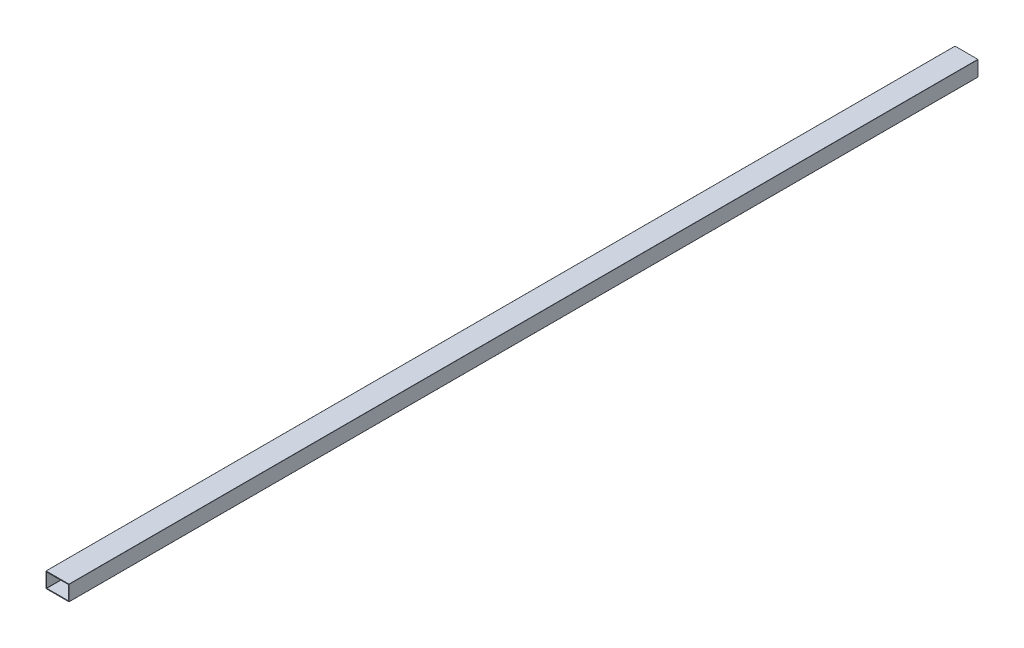
ISO-10303-21;
HEADER;
FILE_DESCRIPTION(('STEP AP214'),'2;1');
FILE_NAME('part.step','',(''),(''),'','','');
FILE_SCHEMA(('AUTOMOTIVE_DESIGN { 1 0 10303 214 1 1 1 1 }'));
ENDSEC;
DATA;
#1=APPLICATION_CONTEXT('core data for automotive mechanical design processes');
#2=APPLICATION_PROTOCOL_DEFINITION('international standard','automotive_design',2000,#1);
#3=PRODUCT_CONTEXT('',#1,'mechanical');
#4=PRODUCT('Part','Part','',(#3));
#5=PRODUCT_RELATED_PRODUCT_CATEGORY('part','',(#4));
#6=PRODUCT_DEFINITION_FORMATION('','',#4);
#7=PRODUCT_DEFINITION_CONTEXT('part definition',#1,'design');
#8=PRODUCT_DEFINITION('design','',#6,#7);
#9=PRODUCT_DEFINITION_SHAPE('','',#8);
#10=(LENGTH_UNIT() NAMED_UNIT(*) SI_UNIT(.MILLI.,.METRE.));
#11=(NAMED_UNIT(*) PLANE_ANGLE_UNIT() SI_UNIT($,.RADIAN.));
#12=(NAMED_UNIT(*) SI_UNIT($,.STERADIAN.) SOLID_ANGLE_UNIT());
#13=UNCERTAINTY_MEASURE_WITH_UNIT(LENGTH_MEASURE(1.E-05),#10,'distance_accuracy_value','');
#14=(GEOMETRIC_REPRESENTATION_CONTEXT(3) GLOBAL_UNCERTAINTY_ASSIGNED_CONTEXT((#13)) GLOBAL_UNIT_ASSIGNED_CONTEXT((#10,
#11,#12)) REPRESENTATION_CONTEXT('',''));
#15=CARTESIAN_POINT('',(0.,0.,0.));
#16=DIRECTION('',(0.,0.,1.));
#17=DIRECTION('',(1.,0.,0.));
#18=AXIS2_PLACEMENT_3D('',#15,#16,#17);
#19=CARTESIAN_POINT('',(76.2,-50.8,-6000.));
#20=DIRECTION('',(1.,0.,0.));
#21=DIRECTION('',(0.,0.,-1.));
#22=AXIS2_PLACEMENT_3D('',#19,#20,#21);
#23=PLANE('',#22);
#24=DIRECTION('',(0.,1.,0.));
#25=VECTOR('',#24,1.);
#26=CARTESIAN_POINT('',(76.2,-50.8,0.));
#27=LINE('',#26,#25);
#28=CARTESIAN_POINT('',(76.2,-49.8,0.));
#29=VERTEX_POINT('',#28);
#30=CARTESIAN_POINT('',(76.2,49.8,0.));
#31=VERTEX_POINT('',#30);
#32=EDGE_CURVE('E197',#29,#31,#27,.T.);
#33=ORIENTED_EDGE('',*,*,#32,.F.);
#34=DIRECTION('',(0.,0.,1.));
#35=VECTOR('',#34,1.);
#36=CARTESIAN_POINT('',(76.2,-49.8,-6000.));
#37=LINE('',#36,#35);
#38=CARTESIAN_POINT('',(76.2,-49.8,-6000.));
#39=VERTEX_POINT('',#38);
#40=EDGE_CURVE('E158',#29,#39,#37,.F.);
#41=ORIENTED_EDGE('',*,*,#40,.T.);
#42=DIRECTION('',(0.,1.,0.));
#43=VECTOR('',#42,1.);
#44=CARTESIAN_POINT('',(76.2,-50.8,-6000.));
#45=LINE('',#44,#43);
#46=CARTESIAN_POINT('',(76.2,49.8,-6000.));
#47=VERTEX_POINT('',#46);
#48=EDGE_CURVE('E185',#39,#47,#45,.T.);
#49=ORIENTED_EDGE('',*,*,#48,.T.);
#50=DIRECTION('',(0.,0.,1.));
#51=VECTOR('',#50,1.);
#52=CARTESIAN_POINT('',(76.2,49.8,-6000.));
#53=LINE('',#52,#51);
#54=EDGE_CURVE('E251',#47,#31,#53,.T.);
#55=ORIENTED_EDGE('',*,*,#54,.T.);
#56=EDGE_LOOP('',(#33,#41,#49,#55));
#57=FACE_BOUND('',#56,.T.);
#58=ADVANCED_FACE('F33',(#57),#23,.T.);
#59=CARTESIAN_POINT('',(-76.2,-50.8,-6000.));
#60=DIRECTION('',(0.,-1.,0.));
#61=DIRECTION('',(0.,0.,-1.));
#62=AXIS2_PLACEMENT_3D('',#59,#60,#61);
#63=PLANE('',#62);
#64=DIRECTION('',(1.,0.,0.));
#65=VECTOR('',#64,1.);
#66=CARTESIAN_POINT('',(-76.2,-50.8,0.));
#67=LINE('',#66,#65);
#68=CARTESIAN_POINT('',(-75.2,-50.8,0.));
#69=VERTEX_POINT('',#68);
#70=CARTESIAN_POINT('',(75.2,-50.8,0.));
#71=VERTEX_POINT('',#70);
#72=EDGE_CURVE('E189',#69,#71,#67,.T.);
#73=ORIENTED_EDGE('',*,*,#72,.F.);
#74=DIRECTION('',(0.,0.,1.));
#75=VECTOR('',#74,1.);
#76=CARTESIAN_POINT('',(-75.2,-50.8,-6000.));
#77=LINE('',#76,#75);
#78=CARTESIAN_POINT('',(-75.2,-50.8,-6000.));
#79=VERTEX_POINT('',#78);
#80=EDGE_CURVE('E238',#69,#79,#77,.F.);
#81=ORIENTED_EDGE('',*,*,#80,.T.);
#82=DIRECTION('',(1.,0.,0.));
#83=VECTOR('',#82,1.);
#84=CARTESIAN_POINT('',(-76.2,-50.8,-6000.));
#85=LINE('',#84,#83);
#86=CARTESIAN_POINT('',(75.2,-50.8,-6000.));
#87=VERTEX_POINT('',#86);
#88=EDGE_CURVE('E194',#79,#87,#85,.T.);
#89=ORIENTED_EDGE('',*,*,#88,.T.);
#90=DIRECTION('',(0.,0.,1.));
#91=VECTOR('',#90,1.);
#92=CARTESIAN_POINT('',(75.2,-50.8,-6000.));
#93=LINE('',#92,#91);
#94=EDGE_CURVE('E235',#87,#71,#93,.T.);
#95=ORIENTED_EDGE('',*,*,#94,.T.);
#96=EDGE_LOOP('',(#73,#81,#89,#95));
#97=FACE_BOUND('',#96,.T.);
#98=ADVANCED_FACE('F305',(#97),#63,.T.);
#99=CARTESIAN_POINT('',(-76.2,-50.8,-6000.));
#100=DIRECTION('',(-1.,0.,0.));
#101=DIRECTION('',(0.,0.,1.));
#102=AXIS2_PLACEMENT_3D('',#99,#100,#101);
#103=PLANE('',#102);
#104=DIRECTION('',(0.,-1.,0.));
#105=VECTOR('',#104,1.);
#106=CARTESIAN_POINT('',(-76.2,-50.8,-6000.));
#107=LINE('',#106,#105);
#108=CARTESIAN_POINT('',(-76.2,49.8,-6000.));
#109=VERTEX_POINT('',#108);
#110=CARTESIAN_POINT('',(-76.2,-49.8,-6000.));
#111=VERTEX_POINT('',#110);
#112=EDGE_CURVE('E191',#109,#111,#107,.T.);
#113=ORIENTED_EDGE('',*,*,#112,.T.);
#114=DIRECTION('',(0.,0.,1.));
#115=VECTOR('',#114,1.);
#116=CARTESIAN_POINT('',(-76.2,-49.8,-6000.));
#117=LINE('',#116,#115);
#118=CARTESIAN_POINT('',(-76.2,-49.8,0.));
#119=VERTEX_POINT('',#118);
#120=EDGE_CURVE('E224',#111,#119,#117,.T.);
#121=ORIENTED_EDGE('',*,*,#120,.T.);
#122=DIRECTION('',(0.,-1.,0.));
#123=VECTOR('',#122,1.);
#124=CARTESIAN_POINT('',(-76.2,-50.8,0.));
#125=LINE('',#124,#123);
#126=CARTESIAN_POINT('',(-76.2,49.8,0.));
#127=VERTEX_POINT('',#126);
#128=EDGE_CURVE('E203',#127,#119,#125,.T.);
#129=ORIENTED_EDGE('',*,*,#128,.F.);
#130=DIRECTION('',(0.,0.,1.));
#131=VECTOR('',#130,1.);
#132=CARTESIAN_POINT('',(-76.2,49.8,-6000.));
#133=LINE('',#132,#131);
#134=EDGE_CURVE('E222',#127,#109,#133,.F.);
#135=ORIENTED_EDGE('',*,*,#134,.T.);
#136=EDGE_LOOP('',(#113,#121,#129,#135));
#137=FACE_BOUND('',#136,.T.);
#138=ADVANCED_FACE('F311',(#137),#103,.T.);
#139=CARTESIAN_POINT('',(-76.2,50.8,-6000.));
#140=DIRECTION('',(0.,1.,0.));
#141=DIRECTION('',(0.,0.,1.));
#142=AXIS2_PLACEMENT_3D('',#139,#140,#141);
#143=PLANE('',#142);
#144=DIRECTION('',(-1.,0.,0.));
#145=VECTOR('',#144,1.);
#146=CARTESIAN_POINT('',(-76.2,50.8,-6000.));
#147=LINE('',#146,#145);
#148=CARTESIAN_POINT('',(75.2,50.8,-6000.));
#149=VERTEX_POINT('',#148);
#150=CARTESIAN_POINT('',(-75.2,50.8,-6000.));
#151=VERTEX_POINT('',#150);
#152=EDGE_CURVE('E188',#149,#151,#147,.T.);
#153=ORIENTED_EDGE('',*,*,#152,.T.);
#154=DIRECTION('',(0.,0.,1.));
#155=VECTOR('',#154,1.);
#156=CARTESIAN_POINT('',(-75.2,50.8,-6000.));
#157=LINE('',#156,#155);
#158=CARTESIAN_POINT('',(-75.2,50.8,0.));
#159=VERTEX_POINT('',#158);
#160=EDGE_CURVE('E248',#151,#159,#157,.T.);
#161=ORIENTED_EDGE('',*,*,#160,.T.);
#162=DIRECTION('',(-1.,0.,0.));
#163=VECTOR('',#162,1.);
#164=CARTESIAN_POINT('',(-76.2,50.8,0.));
#165=LINE('',#164,#163);
#166=CARTESIAN_POINT('',(75.2,50.8,0.));
#167=VERTEX_POINT('',#166);
#168=EDGE_CURVE('E200',#167,#159,#165,.T.);
#169=ORIENTED_EDGE('',*,*,#168,.F.);
#170=DIRECTION('',(0.,0.,1.));
#171=VECTOR('',#170,1.);
#172=CARTESIAN_POINT('',(75.2,50.8,-6000.));
#173=LINE('',#172,#171);
#174=EDGE_CURVE('E55',#167,#149,#173,.F.);
#175=ORIENTED_EDGE('',*,*,#174,.T.);
#176=EDGE_LOOP('',(#153,#161,#169,#175));
#177=FACE_BOUND('',#176,.T.);
#178=ADVANCED_FACE('F316',(#177),#143,.T.);
#179=CARTESIAN_POINT('',(0.,0.,-6000.));
#180=DIRECTION('',(0.,0.,-1.));
#181=DIRECTION('',(-1.,0.,0.));
#182=AXIS2_PLACEMENT_3D('',#179,#180,#181);
#183=PLANE('',#182);
#184=DIRECTION('',(0.,-1.,0.));
#185=VECTOR('',#184,1.);
#186=CARTESIAN_POINT('',(-71.65,-46.25,-6000.));
#187=LINE('',#186,#185);
#188=CARTESIAN_POINT('',(-71.65,45.25,-6000.));
#189=VERTEX_POINT('',#188);
#190=CARTESIAN_POINT('',(-71.65,-45.25,-6000.));
#191=VERTEX_POINT('',#190);
#192=EDGE_CURVE('E167',#189,#191,#187,.T.);
#193=ORIENTED_EDGE('',*,*,#192,.T.);
#194=CARTESIAN_POINT('',(-70.65,-45.25,-6000.));
#195=DIRECTION('',(0.,0.,-1.));
#196=DIRECTION('',(-1.,0.,0.));
#197=AXIS2_PLACEMENT_3D('',#194,#195,#196);
#198=CIRCLE('',#197,1.);
#199=CARTESIAN_POINT('',(-70.65,-46.25,-6000.));
#200=VERTEX_POINT('',#199);
#201=EDGE_CURVE('E11',#191,#200,#198,.F.);
#202=ORIENTED_EDGE('',*,*,#201,.T.);
#203=DIRECTION('',(1.,0.,0.));
#204=VECTOR('',#203,1.);
#205=CARTESIAN_POINT('',(-71.65,-46.25,-6000.));
#206=LINE('',#205,#204);
#207=CARTESIAN_POINT('',(70.65,-46.25,-6000.));
#208=VERTEX_POINT('',#207);
#209=EDGE_CURVE('E175',#200,#208,#206,.T.);
#210=ORIENTED_EDGE('',*,*,#209,.T.);
#211=CARTESIAN_POINT('',(70.65,-45.25,-6000.));
#212=DIRECTION('',(0.,0.,-1.));
#213=DIRECTION('',(-1.,0.,0.));
#214=AXIS2_PLACEMENT_3D('',#211,#212,#213);
#215=CIRCLE('',#214,1.);
#216=CARTESIAN_POINT('',(71.65,-45.25,-6000.));
#217=VERTEX_POINT('',#216);
#218=EDGE_CURVE('E262',#208,#217,#215,.F.);
#219=ORIENTED_EDGE('',*,*,#218,.T.);
#220=DIRECTION('',(0.,1.,0.));
#221=VECTOR('',#220,1.);
#222=CARTESIAN_POINT('',(71.65,-46.25,-6000.));
#223=LINE('',#222,#221);
#224=CARTESIAN_POINT('',(71.65,45.25,-6000.));
#225=VERTEX_POINT('',#224);
#226=EDGE_CURVE('E179',#217,#225,#223,.T.);
#227=ORIENTED_EDGE('',*,*,#226,.T.);
#228=CARTESIAN_POINT('',(70.65,45.25,-6000.));
#229=DIRECTION('',(0.,0.,-1.));
#230=DIRECTION('',(-1.,0.,0.));
#231=AXIS2_PLACEMENT_3D('',#228,#229,#230);
#232=CIRCLE('',#231,1.);
#233=CARTESIAN_POINT('',(70.65,46.25,-6000.));
#234=VERTEX_POINT('',#233);
#235=EDGE_CURVE('E258',#225,#234,#232,.F.);
#236=ORIENTED_EDGE('',*,*,#235,.T.);
#237=DIRECTION('',(-1.,0.,0.));
#238=VECTOR('',#237,1.);
#239=CARTESIAN_POINT('',(-71.65,46.25,-6000.));
#240=LINE('',#239,#238);
#241=CARTESIAN_POINT('',(-70.65,46.25,-6000.));
#242=VERTEX_POINT('',#241);
#243=EDGE_CURVE('E277',#234,#242,#240,.T.);
#244=ORIENTED_EDGE('',*,*,#243,.T.);
#245=CARTESIAN_POINT('',(-70.65,45.25,-6000.));
#246=DIRECTION('',(0.,0.,-1.));
#247=DIRECTION('',(-1.,0.,0.));
#248=AXIS2_PLACEMENT_3D('',#245,#246,#247);
#249=CIRCLE('',#248,1.);
#250=EDGE_CURVE('E157',#242,#189,#249,.F.);
#251=ORIENTED_EDGE('',*,*,#250,.T.);
#252=EDGE_LOOP('',(#193,#202,#210,#219,#227,#236,#244,#251));
#253=FACE_BOUND('',#252,.T.);
#254=ORIENTED_EDGE('',*,*,#88,.F.);
#255=CARTESIAN_POINT('',(-75.2,-49.8,-6000.));
#256=DIRECTION('',(0.,0.,-1.));
#257=DIRECTION('',(-1.,0.,0.));
#258=AXIS2_PLACEMENT_3D('',#255,#256,#257);
#259=CIRCLE('',#258,1.);
#260=EDGE_CURVE('E245',#79,#111,#259,.T.);
#261=ORIENTED_EDGE('',*,*,#260,.T.);
#262=ORIENTED_EDGE('',*,*,#112,.F.);
#263=CARTESIAN_POINT('',(-75.2,49.8,-6000.));
#264=DIRECTION('',(0.,0.,-1.));
#265=DIRECTION('',(-1.,0.,0.));
#266=AXIS2_PLACEMENT_3D('',#263,#264,#265);
#267=CIRCLE('',#266,1.);
#268=EDGE_CURVE('E48',#109,#151,#267,.T.);
#269=ORIENTED_EDGE('',*,*,#268,.T.);
#270=ORIENTED_EDGE('',*,*,#152,.F.);
#271=CARTESIAN_POINT('',(75.2,49.8,-6000.));
#272=DIRECTION('',(0.,0.,-1.));
#273=DIRECTION('',(-1.,0.,0.));
#274=AXIS2_PLACEMENT_3D('',#271,#272,#273);
#275=CIRCLE('',#274,1.);
#276=EDGE_CURVE('E240',#149,#47,#275,.T.);
#277=ORIENTED_EDGE('',*,*,#276,.T.);
#278=ORIENTED_EDGE('',*,*,#48,.F.);
#279=CARTESIAN_POINT('',(75.2,-49.8,-6000.));
#280=DIRECTION('',(0.,0.,-1.));
#281=DIRECTION('',(-1.,0.,0.));
#282=AXIS2_PLACEMENT_3D('',#279,#280,#281);
#283=CIRCLE('',#282,1.);
#284=EDGE_CURVE('E242',#39,#87,#283,.T.);
#285=ORIENTED_EDGE('',*,*,#284,.T.);
#286=EDGE_LOOP('',(#254,#261,#262,#269,#270,#277,#278,#285));
#287=FACE_BOUND('',#286,.T.);
#288=ADVANCED_FACE('F267',(#253,#287),#183,.T.);
#289=CARTESIAN_POINT('',(0.,0.,0.));
#290=DIRECTION('',(0.,0.,-1.));
#291=DIRECTION('',(-1.,0.,0.));
#292=AXIS2_PLACEMENT_3D('',#289,#290,#291);
#293=PLANE('',#292);
#294=DIRECTION('',(0.,1.,0.));
#295=VECTOR('',#294,1.);
#296=CARTESIAN_POINT('',(71.65,-46.25,0.));
#297=LINE('',#296,#295);
#298=CARTESIAN_POINT('',(71.65,-45.25,0.));
#299=VERTEX_POINT('',#298);
#300=CARTESIAN_POINT('',(71.65,45.25,0.));
#301=VERTEX_POINT('',#300);
#302=EDGE_CURVE('E181',#299,#301,#297,.T.);
#303=ORIENTED_EDGE('',*,*,#302,.F.);
#304=CARTESIAN_POINT('',(70.65,-45.25,0.));
#305=DIRECTION('',(0.,0.,-1.));
#306=DIRECTION('',(-1.,0.,0.));
#307=AXIS2_PLACEMENT_3D('',#304,#305,#306);
#308=CIRCLE('',#307,1.);
#309=CARTESIAN_POINT('',(70.65,-46.25,0.));
#310=VERTEX_POINT('',#309);
#311=EDGE_CURVE('E260',#299,#310,#308,.T.);
#312=ORIENTED_EDGE('',*,*,#311,.T.);
#313=DIRECTION('',(1.,0.,0.));
#314=VECTOR('',#313,1.);
#315=CARTESIAN_POINT('',(-71.65,-46.25,0.));
#316=LINE('',#315,#314);
#317=CARTESIAN_POINT('',(-70.65,-46.25,0.));
#318=VERTEX_POINT('',#317);
#319=EDGE_CURVE('E281',#318,#310,#316,.T.);
#320=ORIENTED_EDGE('',*,*,#319,.F.);
#321=CARTESIAN_POINT('',(-70.65,-45.25,0.));
#322=DIRECTION('',(0.,0.,-1.));
#323=DIRECTION('',(-1.,0.,0.));
#324=AXIS2_PLACEMENT_3D('',#321,#322,#323);
#325=CIRCLE('',#324,1.);
#326=CARTESIAN_POINT('',(-71.65,-45.25,0.));
#327=VERTEX_POINT('',#326);
#328=EDGE_CURVE('E41',#318,#327,#325,.T.);
#329=ORIENTED_EDGE('',*,*,#328,.T.);
#330=DIRECTION('',(0.,-1.,0.));
#331=VECTOR('',#330,1.);
#332=CARTESIAN_POINT('',(-71.65,-46.25,0.));
#333=LINE('',#332,#331);
#334=CARTESIAN_POINT('',(-71.65,45.25,0.));
#335=VERTEX_POINT('',#334);
#336=EDGE_CURVE('E164',#335,#327,#333,.T.);
#337=ORIENTED_EDGE('',*,*,#336,.F.);
#338=CARTESIAN_POINT('',(-70.65,45.25,0.));
#339=DIRECTION('',(0.,0.,-1.));
#340=DIRECTION('',(-1.,0.,0.));
#341=AXIS2_PLACEMENT_3D('',#338,#339,#340);
#342=CIRCLE('',#341,1.);
#343=CARTESIAN_POINT('',(-70.65,46.25,0.));
#344=VERTEX_POINT('',#343);
#345=EDGE_CURVE('E147',#335,#344,#342,.T.);
#346=ORIENTED_EDGE('',*,*,#345,.T.);
#347=DIRECTION('',(-1.,0.,0.));
#348=VECTOR('',#347,1.);
#349=CARTESIAN_POINT('',(-71.65,46.25,0.));
#350=LINE('',#349,#348);
#351=CARTESIAN_POINT('',(70.65,46.25,0.));
#352=VERTEX_POINT('',#351);
#353=EDGE_CURVE('E176',#352,#344,#350,.T.);
#354=ORIENTED_EDGE('',*,*,#353,.F.);
#355=CARTESIAN_POINT('',(70.65,45.25,0.));
#356=DIRECTION('',(0.,0.,-1.));
#357=DIRECTION('',(-1.,0.,0.));
#358=AXIS2_PLACEMENT_3D('',#355,#356,#357);
#359=CIRCLE('',#358,1.);
#360=EDGE_CURVE('E256',#352,#301,#359,.T.);
#361=ORIENTED_EDGE('',*,*,#360,.T.);
#362=EDGE_LOOP('',(#303,#312,#320,#329,#337,#346,#354,#361));
#363=FACE_BOUND('',#362,.T.);
#364=ORIENTED_EDGE('',*,*,#128,.T.);
#365=CARTESIAN_POINT('',(-75.2,-49.8,0.));
#366=DIRECTION('',(0.,0.,-1.));
#367=DIRECTION('',(-1.,0.,0.));
#368=AXIS2_PLACEMENT_3D('',#365,#366,#367);
#369=CIRCLE('',#368,1.);
#370=EDGE_CURVE('E233',#119,#69,#369,.F.);
#371=ORIENTED_EDGE('',*,*,#370,.T.);
#372=ORIENTED_EDGE('',*,*,#72,.T.);
#373=CARTESIAN_POINT('',(75.2,-49.8,0.));
#374=DIRECTION('',(0.,0.,-1.));
#375=DIRECTION('',(-1.,0.,0.));
#376=AXIS2_PLACEMENT_3D('',#373,#374,#375);
#377=CIRCLE('',#376,1.);
#378=EDGE_CURVE('E229',#71,#29,#377,.F.);
#379=ORIENTED_EDGE('',*,*,#378,.T.);
#380=ORIENTED_EDGE('',*,*,#32,.T.);
#381=CARTESIAN_POINT('',(75.2,49.8,0.));
#382=DIRECTION('',(0.,0.,-1.));
#383=DIRECTION('',(-1.,0.,0.));
#384=AXIS2_PLACEMENT_3D('',#381,#382,#383);
#385=CIRCLE('',#384,1.);
#386=EDGE_CURVE('E227',#31,#167,#385,.F.);
#387=ORIENTED_EDGE('',*,*,#386,.T.);
#388=ORIENTED_EDGE('',*,*,#168,.T.);
#389=CARTESIAN_POINT('',(-75.2,49.8,0.));
#390=DIRECTION('',(0.,0.,-1.));
#391=DIRECTION('',(-1.,0.,0.));
#392=AXIS2_PLACEMENT_3D('',#389,#390,#391);
#393=CIRCLE('',#392,1.);
#394=EDGE_CURVE('E231',#159,#127,#393,.F.);
#395=ORIENTED_EDGE('',*,*,#394,.T.);
#396=EDGE_LOOP('',(#364,#371,#372,#379,#380,#387,#388,#395));
#397=FACE_BOUND('',#396,.T.);
#398=ADVANCED_FACE('F172',(#363,#397),#293,.F.);
#399=CARTESIAN_POINT('',(-71.65,-46.25,-6000.));
#400=DIRECTION('',(0.,-1.,0.));
#401=DIRECTION('',(0.,0.,-1.));
#402=AXIS2_PLACEMENT_3D('',#399,#400,#401);
#403=PLANE('',#402);
#404=ORIENTED_EDGE('',*,*,#319,.T.);
#405=DIRECTION('',(0.,0.,1.));
#406=VECTOR('',#405,1.);
#407=CARTESIAN_POINT('',(70.65,-46.25,-6000.));
#408=LINE('',#407,#406);
#409=EDGE_CURVE('E220',#310,#208,#408,.F.);
#410=ORIENTED_EDGE('',*,*,#409,.T.);
#411=ORIENTED_EDGE('',*,*,#209,.F.);
#412=DIRECTION('',(0.,0.,1.));
#413=VECTOR('',#412,1.);
#414=CARTESIAN_POINT('',(-70.65,-46.25,0.));
#415=LINE('',#414,#413);
#416=EDGE_CURVE('E217',#200,#318,#415,.T.);
#417=ORIENTED_EDGE('',*,*,#416,.T.);
#418=EDGE_LOOP('',(#404,#410,#411,#417));
#419=FACE_BOUND('',#418,.T.);
#420=ADVANCED_FACE('F283',(#419),#403,.F.);
#421=CARTESIAN_POINT('',(-71.65,-46.25,-6000.));
#422=DIRECTION('',(-1.,0.,0.));
#423=DIRECTION('',(0.,0.,1.));
#424=AXIS2_PLACEMENT_3D('',#421,#422,#423);
#425=PLANE('',#424);
#426=ORIENTED_EDGE('',*,*,#192,.F.);
#427=DIRECTION('',(0.,0.,1.));
#428=VECTOR('',#427,1.);
#429=CARTESIAN_POINT('',(-71.65,45.25,0.));
#430=LINE('',#429,#428);
#431=EDGE_CURVE('E151',#189,#335,#430,.T.);
#432=ORIENTED_EDGE('',*,*,#431,.T.);
#433=ORIENTED_EDGE('',*,*,#336,.T.);
#434=DIRECTION('',(0.,0.,1.));
#435=VECTOR('',#434,1.);
#436=CARTESIAN_POINT('',(-71.65,-45.25,-6000.));
#437=LINE('',#436,#435);
#438=EDGE_CURVE('E169',#327,#191,#437,.F.);
#439=ORIENTED_EDGE('',*,*,#438,.T.);
#440=EDGE_LOOP('',(#426,#432,#433,#439));
#441=FACE_BOUND('',#440,.T.);
#442=ADVANCED_FACE('F163',(#441),#425,.F.);
#443=CARTESIAN_POINT('',(-71.65,46.25,-6000.));
#444=DIRECTION('',(0.,1.,0.));
#445=DIRECTION('',(0.,0.,1.));
#446=AXIS2_PLACEMENT_3D('',#443,#444,#445);
#447=PLANE('',#446);
#448=ORIENTED_EDGE('',*,*,#353,.T.);
#449=DIRECTION('',(0.,0.,1.));
#450=VECTOR('',#449,1.);
#451=CARTESIAN_POINT('',(-70.65,46.25,-6000.));
#452=LINE('',#451,#450);
#453=EDGE_CURVE('E152',#344,#242,#452,.F.);
#454=ORIENTED_EDGE('',*,*,#453,.T.);
#455=ORIENTED_EDGE('',*,*,#243,.F.);
#456=DIRECTION('',(0.,0.,1.));
#457=VECTOR('',#456,1.);
#458=CARTESIAN_POINT('',(70.65,46.25,0.));
#459=LINE('',#458,#457);
#460=EDGE_CURVE('E168',#234,#352,#459,.T.);
#461=ORIENTED_EDGE('',*,*,#460,.T.);
#462=EDGE_LOOP('',(#448,#454,#455,#461));
#463=FACE_BOUND('',#462,.T.);
#464=ADVANCED_FACE('F292',(#463),#447,.F.);
#465=CARTESIAN_POINT('',(71.65,-46.25,-6000.));
#466=DIRECTION('',(1.,0.,0.));
#467=DIRECTION('',(0.,0.,-1.));
#468=AXIS2_PLACEMENT_3D('',#465,#466,#467);
#469=PLANE('',#468);
#470=ORIENTED_EDGE('',*,*,#302,.T.);
#471=DIRECTION('',(0.,0.,1.));
#472=VECTOR('',#471,1.);
#473=CARTESIAN_POINT('',(71.65,45.25,-6000.));
#474=LINE('',#473,#472);
#475=EDGE_CURVE('E215',#301,#225,#474,.F.);
#476=ORIENTED_EDGE('',*,*,#475,.T.);
#477=ORIENTED_EDGE('',*,*,#226,.F.);
#478=DIRECTION('',(0.,0.,1.));
#479=VECTOR('',#478,1.);
#480=CARTESIAN_POINT('',(71.65,-45.25,0.));
#481=LINE('',#480,#479);
#482=EDGE_CURVE('E212',#217,#299,#481,.T.);
#483=ORIENTED_EDGE('',*,*,#482,.T.);
#484=EDGE_LOOP('',(#470,#476,#477,#483));
#485=FACE_BOUND('',#484,.T.);
#486=ADVANCED_FACE('F275',(#485),#469,.F.);
#487=CARTESIAN_POINT('',(-70.65,45.25,-6000.));
#488=DIRECTION('',(0.,0.,-1.));
#489=DIRECTION('',(-1.,0.,0.));
#490=AXIS2_PLACEMENT_3D('',#487,#488,#489);
#491=CYLINDRICAL_SURFACE('',#490,1.);
#492=ORIENTED_EDGE('',*,*,#250,.F.);
#493=ORIENTED_EDGE('',*,*,#453,.F.);
#494=ORIENTED_EDGE('',*,*,#345,.F.);
#495=ORIENTED_EDGE('',*,*,#431,.F.);
#496=EDGE_LOOP('',(#492,#493,#494,#495));
#497=FACE_BOUND('',#496,.T.);
#498=ADVANCED_FACE('F150',(#497),#491,.F.);
#499=CARTESIAN_POINT('',(70.65,45.25,-6000.));
#500=DIRECTION('',(0.,0.,-1.));
#501=DIRECTION('',(-1.,0.,0.));
#502=AXIS2_PLACEMENT_3D('',#499,#500,#501);
#503=CYLINDRICAL_SURFACE('',#502,1.);
#504=ORIENTED_EDGE('',*,*,#235,.F.);
#505=ORIENTED_EDGE('',*,*,#475,.F.);
#506=ORIENTED_EDGE('',*,*,#360,.F.);
#507=ORIENTED_EDGE('',*,*,#460,.F.);
#508=EDGE_LOOP('',(#504,#505,#506,#507));
#509=FACE_BOUND('',#508,.T.);
#510=ADVANCED_FACE('F294',(#509),#503,.F.);
#511=CARTESIAN_POINT('',(70.65,-45.25,-6000.));
#512=DIRECTION('',(0.,0.,-1.));
#513=DIRECTION('',(-1.,0.,0.));
#514=AXIS2_PLACEMENT_3D('',#511,#512,#513);
#515=CYLINDRICAL_SURFACE('',#514,1.);
#516=ORIENTED_EDGE('',*,*,#218,.F.);
#517=ORIENTED_EDGE('',*,*,#409,.F.);
#518=ORIENTED_EDGE('',*,*,#311,.F.);
#519=ORIENTED_EDGE('',*,*,#482,.F.);
#520=EDGE_LOOP('',(#516,#517,#518,#519));
#521=FACE_BOUND('',#520,.T.);
#522=ADVANCED_FACE('F279',(#521),#515,.F.);
#523=CARTESIAN_POINT('',(-75.2,-49.8,-6000.));
#524=DIRECTION('',(0.,0.,1.));
#525=DIRECTION('',(1.,0.,0.));
#526=AXIS2_PLACEMENT_3D('',#523,#524,#525);
#527=CYLINDRICAL_SURFACE('',#526,1.);
#528=ORIENTED_EDGE('',*,*,#260,.F.);
#529=ORIENTED_EDGE('',*,*,#80,.F.);
#530=ORIENTED_EDGE('',*,*,#370,.F.);
#531=ORIENTED_EDGE('',*,*,#120,.F.);
#532=EDGE_LOOP('',(#528,#529,#530,#531));
#533=FACE_BOUND('',#532,.T.);
#534=ADVANCED_FACE('F301',(#533),#527,.T.);
#535=CARTESIAN_POINT('',(-75.2,49.8,-6000.));
#536=DIRECTION('',(0.,0.,1.));
#537=DIRECTION('',(1.,0.,0.));
#538=AXIS2_PLACEMENT_3D('',#535,#536,#537);
#539=CYLINDRICAL_SURFACE('',#538,1.);
#540=ORIENTED_EDGE('',*,*,#268,.F.);
#541=ORIENTED_EDGE('',*,*,#134,.F.);
#542=ORIENTED_EDGE('',*,*,#394,.F.);
#543=ORIENTED_EDGE('',*,*,#160,.F.);
#544=EDGE_LOOP('',(#540,#541,#542,#543));
#545=FACE_BOUND('',#544,.T.);
#546=ADVANCED_FACE('F368',(#545),#539,.T.);
#547=CARTESIAN_POINT('',(-70.65,-45.25,-6000.));
#548=DIRECTION('',(0.,0.,-1.));
#549=DIRECTION('',(-1.,0.,0.));
#550=AXIS2_PLACEMENT_3D('',#547,#548,#549);
#551=CYLINDRICAL_SURFACE('',#550,1.);
#552=ORIENTED_EDGE('',*,*,#201,.F.);
#553=ORIENTED_EDGE('',*,*,#438,.F.);
#554=ORIENTED_EDGE('',*,*,#328,.F.);
#555=ORIENTED_EDGE('',*,*,#416,.F.);
#556=EDGE_LOOP('',(#552,#553,#554,#555));
#557=FACE_BOUND('',#556,.T.);
#558=ADVANCED_FACE('F378',(#557),#551,.F.);
#559=CARTESIAN_POINT('',(75.2,-49.8,-6000.));
#560=DIRECTION('',(0.,0.,1.));
#561=DIRECTION('',(1.,0.,0.));
#562=AXIS2_PLACEMENT_3D('',#559,#560,#561);
#563=CYLINDRICAL_SURFACE('',#562,1.);
#564=ORIENTED_EDGE('',*,*,#284,.F.);
#565=ORIENTED_EDGE('',*,*,#40,.F.);
#566=ORIENTED_EDGE('',*,*,#378,.F.);
#567=ORIENTED_EDGE('',*,*,#94,.F.);
#568=EDGE_LOOP('',(#564,#565,#566,#567));
#569=FACE_BOUND('',#568,.T.);
#570=ADVANCED_FACE('F388',(#569),#563,.T.);
#571=CARTESIAN_POINT('',(75.2,49.8,-6000.));
#572=DIRECTION('',(0.,0.,1.));
#573=DIRECTION('',(1.,0.,0.));
#574=AXIS2_PLACEMENT_3D('',#571,#572,#573);
#575=CYLINDRICAL_SURFACE('',#574,1.);
#576=ORIENTED_EDGE('',*,*,#276,.F.);
#577=ORIENTED_EDGE('',*,*,#174,.F.);
#578=ORIENTED_EDGE('',*,*,#386,.F.);
#579=ORIENTED_EDGE('',*,*,#54,.F.);
#580=EDGE_LOOP('',(#576,#577,#578,#579));
#581=FACE_BOUND('',#580,.T.);
#582=ADVANCED_FACE('F35',(#581),#575,.T.);
#583=CLOSED_SHELL('',(#58,#98,#138,#178,#288,#398,#420,#442,#464,#486,#498,#510,#522,#534,#546,
#558,#570,#582));
#584=MANIFOLD_SOLID_BREP('B2',#583);
#585=ADVANCED_BREP_SHAPE_REPRESENTATION('',(#18,#584),#14);
#586=SHAPE_DEFINITION_REPRESENTATION(#9,#585);
ENDSEC;
END-ISO-10303-21;
